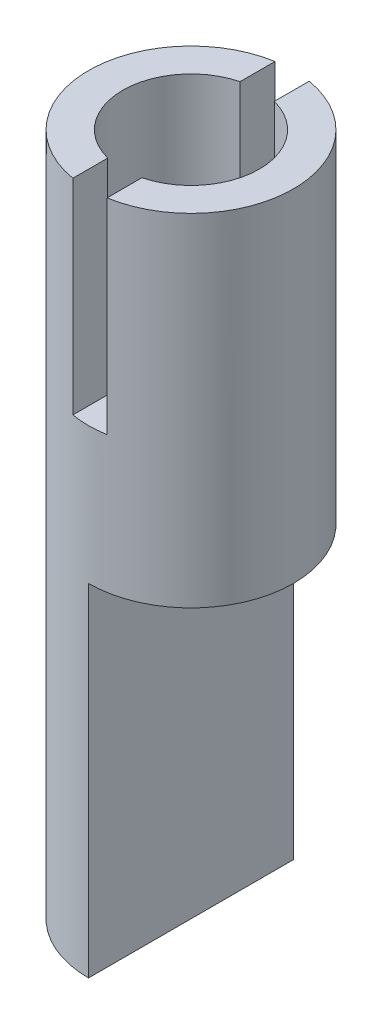
ISO-10303-21;
HEADER;
FILE_DESCRIPTION(('STEP AP214'),'2;1');
FILE_NAME('part.step','',(''),(''),'','','');
FILE_SCHEMA(('AUTOMOTIVE_DESIGN { 1 0 10303 214 1 1 1 1 }'));
ENDSEC;
DATA;
#1=APPLICATION_CONTEXT('core data for automotive mechanical design processes');
#2=APPLICATION_PROTOCOL_DEFINITION('international standard','automotive_design',2000,#1);
#3=PRODUCT_CONTEXT('',#1,'mechanical');
#4=PRODUCT('Part','Part','',(#3));
#5=PRODUCT_RELATED_PRODUCT_CATEGORY('part','',(#4));
#6=PRODUCT_DEFINITION_FORMATION('','',#4);
#7=PRODUCT_DEFINITION_CONTEXT('part definition',#1,'design');
#8=PRODUCT_DEFINITION('design','',#6,#7);
#9=PRODUCT_DEFINITION_SHAPE('','',#8);
#10=(LENGTH_UNIT() NAMED_UNIT(*) SI_UNIT(.MILLI.,.METRE.));
#11=(NAMED_UNIT(*) PLANE_ANGLE_UNIT() SI_UNIT($,.RADIAN.));
#12=(NAMED_UNIT(*) SI_UNIT($,.STERADIAN.) SOLID_ANGLE_UNIT());
#13=UNCERTAINTY_MEASURE_WITH_UNIT(LENGTH_MEASURE(1.E-05),#10,'distance_accuracy_value','');
#14=(GEOMETRIC_REPRESENTATION_CONTEXT(3) GLOBAL_UNCERTAINTY_ASSIGNED_CONTEXT((#13)) GLOBAL_UNIT_ASSIGNED_CONTEXT((#10,
#11,#12)) REPRESENTATION_CONTEXT('',''));
#15=CARTESIAN_POINT('',(0.,0.,0.));
#16=DIRECTION('',(0.,0.,1.));
#17=DIRECTION('',(1.,0.,0.));
#18=AXIS2_PLACEMENT_3D('',#15,#16,#17);
#19=CARTESIAN_POINT('',(0.,20.,0.));
#20=DIRECTION('',(0.,1.,0.));
#21=DIRECTION('',(0.,0.,1.));
#22=AXIS2_PLACEMENT_3D('',#19,#20,#21);
#23=PLANE('',#22);
#24=DIRECTION('',(0.,0.,1.));
#25=VECTOR('',#24,1.);
#26=CARTESIAN_POINT('',(-0.5,20.,1.93649167310371));
#27=LINE('',#26,#25);
#28=CARTESIAN_POINT('',(-0.5,20.,1.93649167310371));
#29=VERTEX_POINT('',#28);
#30=CARTESIAN_POINT('',(-0.499999999999999,20.,2.95803989154981));
#31=VERTEX_POINT('',#30);
#32=EDGE_CURVE('E132',#29,#31,#27,.T.);
#33=ORIENTED_EDGE('',*,*,#32,.F.);
#34=CARTESIAN_POINT('',(0.,20.,0.));
#35=DIRECTION('',(0.,1.,0.));
#36=DIRECTION('',(0.,0.,1.));
#37=AXIS2_PLACEMENT_3D('',#34,#35,#36);
#38=CIRCLE('',#37,2.);
#39=CARTESIAN_POINT('',(-0.499999999999999,20.,-1.93649167310371));
#40=VERTEX_POINT('',#39);
#41=EDGE_CURVE('E134',#40,#29,#38,.T.);
#42=ORIENTED_EDGE('',*,*,#41,.F.);
#43=DIRECTION('',(0.,0.,1.));
#44=VECTOR('',#43,1.);
#45=CARTESIAN_POINT('',(-0.5,20.,0.));
#46=LINE('',#45,#44);
#47=CARTESIAN_POINT('',(-0.5,20.,-2.95803989154981));
#48=VERTEX_POINT('',#47);
#49=EDGE_CURVE('E185',#48,#40,#46,.T.);
#50=ORIENTED_EDGE('',*,*,#49,.F.);
#51=CARTESIAN_POINT('',(0.,20.,0.));
#52=DIRECTION('',(0.,1.,0.));
#53=DIRECTION('',(0.,0.,1.));
#54=AXIS2_PLACEMENT_3D('',#51,#52,#53);
#55=CIRCLE('',#54,3.);
#56=EDGE_CURVE('E182',#48,#31,#55,.T.);
#57=ORIENTED_EDGE('',*,*,#56,.T.);
#58=EDGE_LOOP('',(#33,#42,#50,#57));
#59=FACE_BOUND('',#58,.T.);
#60=ADVANCED_FACE('F34',(#59),#23,.T.);
#61=CARTESIAN_POINT('',(0.,20.,0.));
#62=DIRECTION('',(0.,-1.,0.));
#63=DIRECTION('',(0.,0.,-1.));
#64=AXIS2_PLACEMENT_3D('',#61,#62,#63);
#65=CYLINDRICAL_SURFACE('',#64,3.);
#66=ORIENTED_EDGE('',*,*,#56,.F.);
#67=DIRECTION('',(0.,-1.,0.));
#68=VECTOR('',#67,1.);
#69=CARTESIAN_POINT('',(-0.5,20.,-2.95803989154981));
#70=LINE('',#69,#68);
#71=CARTESIAN_POINT('',(-0.5,14.,-2.95803989154981));
#72=VERTEX_POINT('',#71);
#73=EDGE_CURVE('E157',#48,#72,#70,.T.);
#74=ORIENTED_EDGE('',*,*,#73,.T.);
#75=CARTESIAN_POINT('',(0.,14.,0.));
#76=DIRECTION('',(0.,1.,0.));
#77=DIRECTION('',(0.,0.,1.));
#78=AXIS2_PLACEMENT_3D('',#75,#76,#77);
#79=CIRCLE('',#78,3.);
#80=CARTESIAN_POINT('',(0.5,14.,-2.95803989154981));
#81=VERTEX_POINT('',#80);
#82=EDGE_CURVE('E11',#81,#72,#79,.T.);
#83=ORIENTED_EDGE('',*,*,#82,.F.);
#84=DIRECTION('',(0.,-1.,0.));
#85=VECTOR('',#84,1.);
#86=CARTESIAN_POINT('',(0.5,20.,-2.95803989154981));
#87=LINE('',#86,#85);
#88=CARTESIAN_POINT('',(0.5,20.,-2.95803989154981));
#89=VERTEX_POINT('',#88);
#90=EDGE_CURVE('E124',#81,#89,#87,.F.);
#91=ORIENTED_EDGE('',*,*,#90,.T.);
#92=CARTESIAN_POINT('',(0.500000000000001,20.,2.95803989154981));
#93=VERTEX_POINT('',#92);
#94=EDGE_CURVE('E178',#93,#89,#55,.T.);
#95=ORIENTED_EDGE('',*,*,#94,.F.);
#96=DIRECTION('',(0.,-1.,0.));
#97=VECTOR('',#96,1.);
#98=CARTESIAN_POINT('',(0.5,20.,2.95803989154981));
#99=LINE('',#98,#97);
#100=CARTESIAN_POINT('',(0.5,14.,2.95803989154981));
#101=VERTEX_POINT('',#100);
#102=EDGE_CURVE('E163',#93,#101,#99,.T.);
#103=ORIENTED_EDGE('',*,*,#102,.T.);
#104=CARTESIAN_POINT('',(-0.5,14.,2.95803989154981));
#105=VERTEX_POINT('',#104);
#106=EDGE_CURVE('E38',#105,#101,#79,.T.);
#107=ORIENTED_EDGE('',*,*,#106,.F.);
#108=DIRECTION('',(0.,-1.,0.));
#109=VECTOR('',#108,1.);
#110=CARTESIAN_POINT('',(-0.5,20.,2.95803989154981));
#111=LINE('',#110,#109);
#112=EDGE_CURVE('E160',#105,#31,#111,.F.);
#113=ORIENTED_EDGE('',*,*,#112,.T.);
#114=EDGE_LOOP('',(#66,#74,#83,#91,#95,#103,#107,#113));
#115=FACE_BOUND('',#114,.T.);
#116=CARTESIAN_POINT('',(0.,10.,0.));
#117=DIRECTION('',(0.,-1.,0.));
#118=DIRECTION('',(0.,0.,1.));
#119=AXIS2_PLACEMENT_3D('',#116,#117,#118);
#120=CIRCLE('',#119,3.);
#121=CARTESIAN_POINT('',(0.,10.,-3.));
#122=VERTEX_POINT('',#121);
#123=CARTESIAN_POINT('',(0.,10.,3.));
#124=VERTEX_POINT('',#123);
#125=EDGE_CURVE('E167',#122,#124,#120,.T.);
#126=ORIENTED_EDGE('',*,*,#125,.F.);
#127=DIRECTION('',(0.,-1.,0.));
#128=VECTOR('',#127,1.);
#129=CARTESIAN_POINT('',(0.,10.,-3.));
#130=LINE('',#129,#128);
#131=CARTESIAN_POINT('',(0.,0.,-3.));
#132=VERTEX_POINT('',#131);
#133=EDGE_CURVE('E173',#122,#132,#130,.T.);
#134=ORIENTED_EDGE('',*,*,#133,.T.);
#135=CARTESIAN_POINT('',(0.,0.,0.));
#136=DIRECTION('',(0.,1.,0.));
#137=DIRECTION('',(0.,0.,1.));
#138=AXIS2_PLACEMENT_3D('',#135,#136,#137);
#139=CIRCLE('',#138,3.);
#140=CARTESIAN_POINT('',(0.,0.,3.));
#141=VERTEX_POINT('',#140);
#142=EDGE_CURVE('E176',#132,#141,#139,.T.);
#143=ORIENTED_EDGE('',*,*,#142,.T.);
#144=DIRECTION('',(0.,-1.,0.));
#145=VECTOR('',#144,1.);
#146=CARTESIAN_POINT('',(0.,10.,3.));
#147=LINE('',#146,#145);
#148=EDGE_CURVE('E57',#124,#141,#147,.T.);
#149=ORIENTED_EDGE('',*,*,#148,.F.);
#150=EDGE_LOOP('',(#126,#134,#143,#149));
#151=FACE_BOUND('',#150,.T.);
#152=ADVANCED_FACE('F36',(#115,#151),#65,.T.);
#153=DIRECTION('',(0.,0.,-1.));
#154=VECTOR('',#153,1.);
#155=CARTESIAN_POINT('',(0.5,20.,0.));
#156=LINE('',#155,#154);
#157=CARTESIAN_POINT('',(0.5,20.,1.93649167310371));
#158=VERTEX_POINT('',#157);
#159=EDGE_CURVE('E181',#93,#158,#156,.T.);
#160=ORIENTED_EDGE('',*,*,#159,.F.);
#161=ORIENTED_EDGE('',*,*,#94,.T.);
#162=DIRECTION('',(0.,0.,-1.));
#163=VECTOR('',#162,1.);
#164=CARTESIAN_POINT('',(0.5,20.,-3.92273147775768));
#165=LINE('',#164,#163);
#166=CARTESIAN_POINT('',(0.5,20.,-1.93649167310371));
#167=VERTEX_POINT('',#166);
#168=EDGE_CURVE('E146',#167,#89,#165,.T.);
#169=ORIENTED_EDGE('',*,*,#168,.F.);
#170=CARTESIAN_POINT('',(0.,20.,0.));
#171=DIRECTION('',(0.,1.,0.));
#172=DIRECTION('',(0.,0.,1.));
#173=AXIS2_PLACEMENT_3D('',#170,#171,#172);
#174=CIRCLE('',#173,2.);
#175=EDGE_CURVE('E49',#158,#167,#174,.T.);
#176=ORIENTED_EDGE('',*,*,#175,.F.);
#177=EDGE_LOOP('',(#160,#161,#169,#176));
#178=FACE_BOUND('',#177,.T.);
#179=ADVANCED_FACE('F199',(#178),#23,.T.);
#180=CARTESIAN_POINT('',(0.,0.,0.));
#181=DIRECTION('',(0.,1.,0.));
#182=DIRECTION('',(0.,0.,1.));
#183=AXIS2_PLACEMENT_3D('',#180,#181,#182);
#184=PLANE('',#183);
#185=ORIENTED_EDGE('',*,*,#142,.F.);
#186=DIRECTION('',(0.,0.,-1.));
#187=VECTOR('',#186,1.);
#188=CARTESIAN_POINT('',(0.,0.,3.));
#189=LINE('',#188,#187);
#190=EDGE_CURVE('E166',#141,#132,#189,.T.);
#191=ORIENTED_EDGE('',*,*,#190,.F.);
#192=EDGE_LOOP('',(#185,#191));
#193=FACE_BOUND('',#192,.T.);
#194=ADVANCED_FACE('F201',(#193),#184,.F.);
#195=CARTESIAN_POINT('',(0.,10.,3.));
#196=DIRECTION('',(-1.,0.,0.));
#197=DIRECTION('',(0.,0.,1.));
#198=AXIS2_PLACEMENT_3D('',#195,#196,#197);
#199=PLANE('',#198);
#200=ORIENTED_EDGE('',*,*,#190,.T.);
#201=ORIENTED_EDGE('',*,*,#133,.F.);
#202=DIRECTION('',(0.,0.,-1.));
#203=VECTOR('',#202,1.);
#204=CARTESIAN_POINT('',(0.,10.,3.));
#205=LINE('',#204,#203);
#206=EDGE_CURVE('E169',#124,#122,#205,.T.);
#207=ORIENTED_EDGE('',*,*,#206,.F.);
#208=ORIENTED_EDGE('',*,*,#148,.T.);
#209=EDGE_LOOP('',(#200,#201,#207,#208));
#210=FACE_BOUND('',#209,.T.);
#211=ADVANCED_FACE('F207',(#210),#199,.F.);
#212=CARTESIAN_POINT('',(0.,10.,0.));
#213=DIRECTION('',(0.,1.,0.));
#214=DIRECTION('',(0.,0.,1.));
#215=AXIS2_PLACEMENT_3D('',#212,#213,#214);
#216=PLANE('',#215);
#217=ORIENTED_EDGE('',*,*,#125,.T.);
#218=ORIENTED_EDGE('',*,*,#206,.T.);
#219=EDGE_LOOP('',(#217,#218));
#220=FACE_BOUND('',#219,.T.);
#221=ADVANCED_FACE('F237',(#220),#216,.F.);
#222=CARTESIAN_POINT('',(0.,14.,0.));
#223=DIRECTION('',(0.,1.,0.));
#224=DIRECTION('',(0.,0.,1.));
#225=AXIS2_PLACEMENT_3D('',#222,#223,#224);
#226=PLANE('',#225);
#227=ORIENTED_EDGE('',*,*,#82,.T.);
#228=DIRECTION('',(0.,0.,1.));
#229=VECTOR('',#228,1.);
#230=CARTESIAN_POINT('',(-0.5,14.,-3.92273147775768));
#231=LINE('',#230,#229);
#232=CARTESIAN_POINT('',(-0.499999999999999,14.,-1.93649167310371));
#233=VERTEX_POINT('',#232);
#234=EDGE_CURVE('E127',#72,#233,#231,.T.);
#235=ORIENTED_EDGE('',*,*,#234,.T.);
#236=CARTESIAN_POINT('',(0.,14.,0.));
#237=DIRECTION('',(0.,1.,0.));
#238=DIRECTION('',(0.,0.,1.));
#239=AXIS2_PLACEMENT_3D('',#236,#237,#238);
#240=CIRCLE('',#239,2.);
#241=CARTESIAN_POINT('',(-0.5,14.,1.93649167310371));
#242=VERTEX_POINT('',#241);
#243=EDGE_CURVE('E138',#233,#242,#240,.T.);
#244=ORIENTED_EDGE('',*,*,#243,.T.);
#245=DIRECTION('',(0.,0.,1.));
#246=VECTOR('',#245,1.);
#247=CARTESIAN_POINT('',(-0.5,14.,1.93649167310371));
#248=LINE('',#247,#246);
#249=EDGE_CURVE('E141',#242,#105,#248,.T.);
#250=ORIENTED_EDGE('',*,*,#249,.T.);
#251=ORIENTED_EDGE('',*,*,#106,.T.);
#252=DIRECTION('',(0.,0.,-1.));
#253=VECTOR('',#252,1.);
#254=CARTESIAN_POINT('',(0.5,14.,1.93649167310371));
#255=LINE('',#254,#253);
#256=CARTESIAN_POINT('',(0.5,14.,1.93649167310371));
#257=VERTEX_POINT('',#256);
#258=EDGE_CURVE('E118',#101,#257,#255,.T.);
#259=ORIENTED_EDGE('',*,*,#258,.T.);
#260=CARTESIAN_POINT('',(0.,14.,0.));
#261=DIRECTION('',(0.,1.,0.));
#262=DIRECTION('',(0.,0.,1.));
#263=AXIS2_PLACEMENT_3D('',#260,#261,#262);
#264=CIRCLE('',#263,2.);
#265=CARTESIAN_POINT('',(0.5,14.,-1.93649167310371));
#266=VERTEX_POINT('',#265);
#267=EDGE_CURVE('E114',#257,#266,#264,.T.);
#268=ORIENTED_EDGE('',*,*,#267,.T.);
#269=DIRECTION('',(0.,0.,-1.));
#270=VECTOR('',#269,1.);
#271=CARTESIAN_POINT('',(0.5,14.,-3.92273147775768));
#272=LINE('',#271,#270);
#273=EDGE_CURVE('E121',#266,#81,#272,.T.);
#274=ORIENTED_EDGE('',*,*,#273,.T.);
#275=EDGE_LOOP('',(#227,#235,#244,#250,#251,#259,#268,#274));
#276=FACE_BOUND('',#275,.T.);
#277=ADVANCED_FACE('F129',(#276),#226,.T.);
#278=CARTESIAN_POINT('',(0.5,14.,1.93649167310371));
#279=DIRECTION('',(1.,0.,0.));
#280=DIRECTION('',(0.,0.,-1.));
#281=AXIS2_PLACEMENT_3D('',#278,#279,#280);
#282=PLANE('',#281);
#283=ORIENTED_EDGE('',*,*,#159,.T.);
#284=DIRECTION('',(0.,1.,0.));
#285=VECTOR('',#284,1.);
#286=CARTESIAN_POINT('',(0.5,14.,1.93649167310371));
#287=LINE('',#286,#285);
#288=EDGE_CURVE('E150',#257,#158,#287,.T.);
#289=ORIENTED_EDGE('',*,*,#288,.F.);
#290=ORIENTED_EDGE('',*,*,#258,.F.);
#291=ORIENTED_EDGE('',*,*,#102,.F.);
#292=EDGE_LOOP('',(#283,#289,#290,#291));
#293=FACE_BOUND('',#292,.T.);
#294=ADVANCED_FACE('F193',(#293),#282,.F.);
#295=CARTESIAN_POINT('',(-0.5,14.,1.93649167310371));
#296=DIRECTION('',(-1.,0.,0.));
#297=DIRECTION('',(0.,0.,1.));
#298=AXIS2_PLACEMENT_3D('',#295,#296,#297);
#299=PLANE('',#298);
#300=ORIENTED_EDGE('',*,*,#249,.F.);
#301=DIRECTION('',(0.,1.,0.));
#302=VECTOR('',#301,1.);
#303=CARTESIAN_POINT('',(-0.5,14.,1.93649167310371));
#304=LINE('',#303,#302);
#305=EDGE_CURVE('E152',#242,#29,#304,.T.);
#306=ORIENTED_EDGE('',*,*,#305,.T.);
#307=ORIENTED_EDGE('',*,*,#32,.T.);
#308=ORIENTED_EDGE('',*,*,#112,.F.);
#309=EDGE_LOOP('',(#300,#306,#307,#308));
#310=FACE_BOUND('',#309,.T.);
#311=ADVANCED_FACE('F218',(#310),#299,.F.);
#312=CARTESIAN_POINT('',(-0.5,14.,-3.92273147775768));
#313=DIRECTION('',(-1.,0.,0.));
#314=DIRECTION('',(0.,0.,1.));
#315=AXIS2_PLACEMENT_3D('',#312,#313,#314);
#316=PLANE('',#315);
#317=ORIENTED_EDGE('',*,*,#49,.T.);
#318=DIRECTION('',(0.,1.,0.));
#319=VECTOR('',#318,1.);
#320=CARTESIAN_POINT('',(-0.499999999999999,14.,-1.93649167310371));
#321=LINE('',#320,#319);
#322=EDGE_CURVE('E117',#233,#40,#321,.T.);
#323=ORIENTED_EDGE('',*,*,#322,.F.);
#324=ORIENTED_EDGE('',*,*,#234,.F.);
#325=ORIENTED_EDGE('',*,*,#73,.F.);
#326=EDGE_LOOP('',(#317,#323,#324,#325));
#327=FACE_BOUND('',#326,.T.);
#328=ADVANCED_FACE('F220',(#327),#316,.F.);
#329=CARTESIAN_POINT('',(0.5,14.,-3.92273147775768));
#330=DIRECTION('',(1.,0.,0.));
#331=DIRECTION('',(0.,0.,-1.));
#332=AXIS2_PLACEMENT_3D('',#329,#330,#331);
#333=PLANE('',#332);
#334=ORIENTED_EDGE('',*,*,#273,.F.);
#335=DIRECTION('',(0.,1.,0.));
#336=VECTOR('',#335,1.);
#337=CARTESIAN_POINT('',(0.5,14.,-1.93649167310371));
#338=LINE('',#337,#336);
#339=EDGE_CURVE('E110',#266,#167,#338,.T.);
#340=ORIENTED_EDGE('',*,*,#339,.T.);
#341=ORIENTED_EDGE('',*,*,#168,.T.);
#342=ORIENTED_EDGE('',*,*,#90,.F.);
#343=EDGE_LOOP('',(#334,#340,#341,#342));
#344=FACE_BOUND('',#343,.T.);
#345=ADVANCED_FACE('F122',(#344),#333,.F.);
#346=CARTESIAN_POINT('',(0.,14.,0.));
#347=DIRECTION('',(0.,1.,0.));
#348=DIRECTION('',(0.,0.,1.));
#349=AXIS2_PLACEMENT_3D('',#346,#347,#348);
#350=CYLINDRICAL_SURFACE('',#349,2.);
#351=ORIENTED_EDGE('',*,*,#175,.T.);
#352=ORIENTED_EDGE('',*,*,#339,.F.);
#353=ORIENTED_EDGE('',*,*,#267,.F.);
#354=ORIENTED_EDGE('',*,*,#288,.T.);
#355=EDGE_LOOP('',(#351,#352,#353,#354));
#356=FACE_BOUND('',#355,.T.);
#357=ADVANCED_FACE('F112',(#356),#350,.F.);
#358=CARTESIAN_POINT('',(0.,14.,0.));
#359=DIRECTION('',(0.,1.,0.));
#360=DIRECTION('',(0.,0.,1.));
#361=AXIS2_PLACEMENT_3D('',#358,#359,#360);
#362=CYLINDRICAL_SURFACE('',#361,2.);
#363=ORIENTED_EDGE('',*,*,#41,.T.);
#364=ORIENTED_EDGE('',*,*,#305,.F.);
#365=ORIENTED_EDGE('',*,*,#243,.F.);
#366=ORIENTED_EDGE('',*,*,#322,.T.);
#367=EDGE_LOOP('',(#363,#364,#365,#366));
#368=FACE_BOUND('',#367,.T.);
#369=ADVANCED_FACE('F223',(#368),#362,.F.);
#370=CLOSED_SHELL('',(#60,#152,#179,#194,#211,#221,#277,#294,#311,#328,#345,#357,#369));
#371=MANIFOLD_SOLID_BREP('B2',#370);
#372=ADVANCED_BREP_SHAPE_REPRESENTATION('',(#18,#371),#14);
#373=SHAPE_DEFINITION_REPRESENTATION(#9,#372);
ENDSEC;
END-ISO-10303-21;
